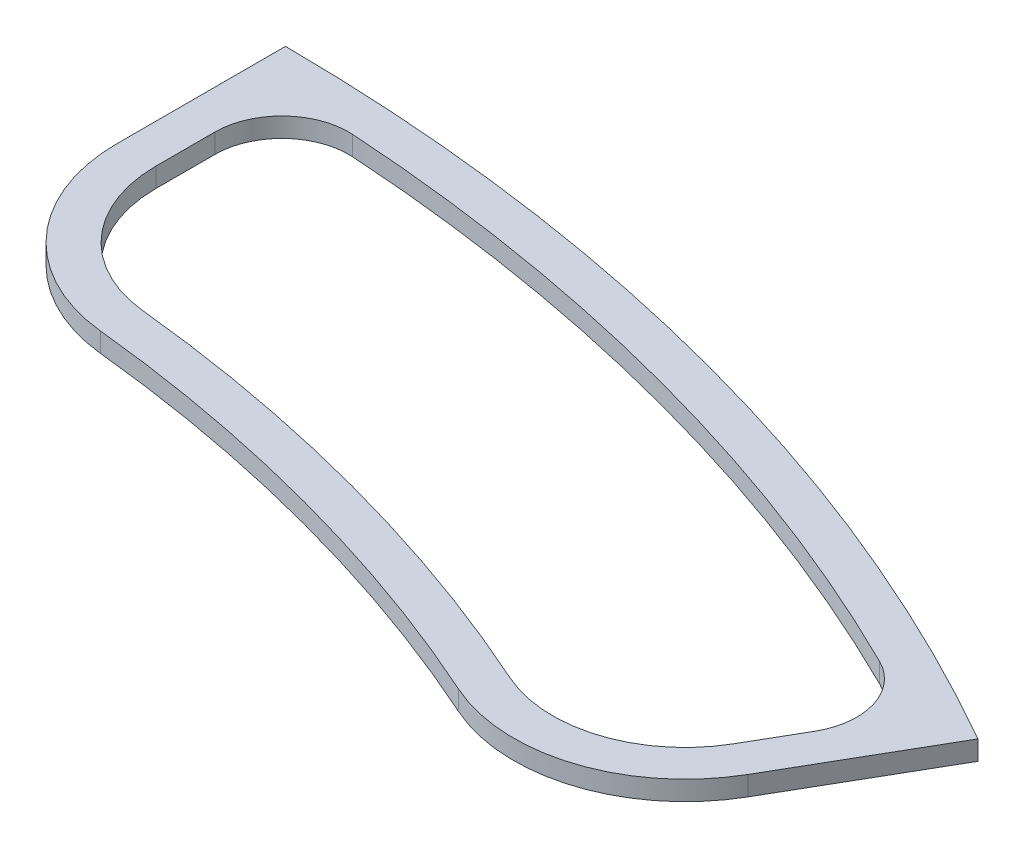
ISO-10303-21;
HEADER;
FILE_DESCRIPTION(('STEP AP214'),'2;1');
FILE_NAME('part.step','',(''),(''),'','','');
FILE_SCHEMA(('AUTOMOTIVE_DESIGN { 1 0 10303 214 1 1 1 1 }'));
ENDSEC;
DATA;
#1=APPLICATION_CONTEXT('core data for automotive mechanical design processes');
#2=APPLICATION_PROTOCOL_DEFINITION('international standard','automotive_design',2000,#1);
#3=PRODUCT_CONTEXT('',#1,'mechanical');
#4=PRODUCT('Part','Part','',(#3));
#5=PRODUCT_RELATED_PRODUCT_CATEGORY('part','',(#4));
#6=PRODUCT_DEFINITION_FORMATION('','',#4);
#7=PRODUCT_DEFINITION_CONTEXT('part definition',#1,'design');
#8=PRODUCT_DEFINITION('design','',#6,#7);
#9=PRODUCT_DEFINITION_SHAPE('','',#8);
#10=(LENGTH_UNIT() NAMED_UNIT(*) SI_UNIT(.MILLI.,.METRE.));
#11=(NAMED_UNIT(*) PLANE_ANGLE_UNIT() SI_UNIT($,.RADIAN.));
#12=(NAMED_UNIT(*) SI_UNIT($,.STERADIAN.) SOLID_ANGLE_UNIT());
#13=UNCERTAINTY_MEASURE_WITH_UNIT(LENGTH_MEASURE(1.E-05),#10,'distance_accuracy_value','');
#14=(GEOMETRIC_REPRESENTATION_CONTEXT(3) GLOBAL_UNCERTAINTY_ASSIGNED_CONTEXT((#13)) GLOBAL_UNIT_ASSIGNED_CONTEXT((#10,
#11,#12)) REPRESENTATION_CONTEXT('',''));
#15=CARTESIAN_POINT('',(0.,0.,0.));
#16=DIRECTION('',(0.,0.,1.));
#17=DIRECTION('',(1.,0.,0.));
#18=AXIS2_PLACEMENT_3D('',#15,#16,#17);
#19=CARTESIAN_POINT('',(0.,3.,0.));
#20=DIRECTION('',(0.,-1.,0.));
#21=DIRECTION('',(0.,0.,-1.));
#22=AXIS2_PLACEMENT_3D('',#19,#20,#21);
#23=CYLINDRICAL_SURFACE('',#22,297.5);
#24=CARTESIAN_POINT('',(0.,0.,0.));
#25=DIRECTION('',(0.,1.,0.));
#26=DIRECTION('',(0.,0.,-1.));
#27=AXIS2_PLACEMENT_3D('',#24,#25,#26);
#28=CIRCLE('',#27,297.5);
#29=CARTESIAN_POINT('',(147.449071126004,0.,-258.389282719076));
#30=VERTEX_POINT('',#29);
#31=CARTESIAN_POINT('',(1.50000000000001,0.,-297.496218463361));
#32=VERTEX_POINT('',#31);
#33=EDGE_CURVE('E160',#30,#32,#28,.T.);
#34=ORIENTED_EDGE('',*,*,#33,.T.);
#35=DIRECTION('',(0.,-1.,0.));
#36=VECTOR('',#35,1.);
#37=CARTESIAN_POINT('',(1.50000000000001,3.,-297.496218463361));
#38=LINE('',#37,#36);
#39=CARTESIAN_POINT('',(1.50000000000001,3.,-297.496218463361));
#40=VERTEX_POINT('',#39);
#41=EDGE_CURVE('E11',#40,#32,#38,.T.);
#42=ORIENTED_EDGE('',*,*,#41,.F.);
#43=CARTESIAN_POINT('',(0.,3.,0.));
#44=DIRECTION('',(0.,1.,0.));
#45=DIRECTION('',(0.,0.,-1.));
#46=AXIS2_PLACEMENT_3D('',#43,#44,#45);
#47=CIRCLE('',#46,297.5);
#48=CARTESIAN_POINT('',(147.449071126004,3.,-258.389282719076));
#49=VERTEX_POINT('',#48);
#50=EDGE_CURVE('E164',#49,#40,#47,.T.);
#51=ORIENTED_EDGE('',*,*,#50,.F.);
#52=DIRECTION('',(0.,-1.,0.));
#53=VECTOR('',#52,1.);
#54=CARTESIAN_POINT('',(147.449071126004,3.,-258.389282719076));
#55=LINE('',#54,#53);
#56=EDGE_CURVE('E170',#49,#30,#55,.T.);
#57=ORIENTED_EDGE('',*,*,#56,.T.);
#58=EDGE_LOOP('',(#34,#42,#51,#57));
#59=FACE_BOUND('',#58,.T.);
#60=ADVANCED_FACE('F47',(#59),#23,.T.);
#61=CARTESIAN_POINT('',(1.50000000000001,3.,-297.496218463361));
#62=DIRECTION('',(1.,0.,0.));
#63=DIRECTION('',(0.,0.,-1.));
#64=AXIS2_PLACEMENT_3D('',#61,#62,#63);
#65=PLANE('',#64);
#66=DIRECTION('',(0.,0.,1.));
#67=VECTOR('',#66,1.);
#68=CARTESIAN_POINT('',(1.50000000000001,0.,-297.496218463361));
#69=LINE('',#68,#67);
#70=CARTESIAN_POINT('',(1.50000000000001,0.,-271.496218463361));
#71=VERTEX_POINT('',#70);
#72=EDGE_CURVE('E76',#32,#71,#69,.T.);
#73=ORIENTED_EDGE('',*,*,#72,.T.);
#74=DIRECTION('',(0.,-1.,0.));
#75=VECTOR('',#74,1.);
#76=CARTESIAN_POINT('',(1.50000000000001,3.,-271.496218463361));
#77=LINE('',#76,#75);
#78=CARTESIAN_POINT('',(1.50000000000001,3.,-271.496218463361));
#79=VERTEX_POINT('',#78);
#80=EDGE_CURVE('E56',#79,#71,#77,.T.);
#81=ORIENTED_EDGE('',*,*,#80,.F.);
#82=DIRECTION('',(0.,0.,1.));
#83=VECTOR('',#82,1.);
#84=CARTESIAN_POINT('',(1.50000000000001,3.,-297.496218463361));
#85=LINE('',#84,#83);
#86=EDGE_CURVE('E180',#40,#79,#85,.T.);
#87=ORIENTED_EDGE('',*,*,#86,.F.);
#88=ORIENTED_EDGE('',*,*,#41,.T.);
#89=EDGE_LOOP('',(#73,#81,#87,#88));
#90=FACE_BOUND('',#89,.T.);
#91=ADVANCED_FACE('F155',(#90),#65,.F.);
#92=CARTESIAN_POINT('',(147.449071126004,3.,-258.389282719076));
#93=DIRECTION('',(-0.866025403784438,0.,-0.500000000000001));
#94=DIRECTION('',(-0.500000000000001,0.,0.866025403784438));
#95=AXIS2_PLACEMENT_3D('',#92,#93,#94);
#96=PLANE('',#95);
#97=DIRECTION('',(0.500000000000001,0.,-0.866025403784438));
#98=VECTOR('',#97,1.);
#99=CARTESIAN_POINT('',(147.449071126004,0.,-258.389282719076));
#100=LINE('',#99,#98);
#101=CARTESIAN_POINT('',(134.449071126004,0.,-235.87262222068));
#102=VERTEX_POINT('',#101);
#103=EDGE_CURVE('E159',#102,#30,#100,.T.);
#104=ORIENTED_EDGE('',*,*,#103,.T.);
#105=ORIENTED_EDGE('',*,*,#56,.F.);
#106=DIRECTION('',(0.500000000000001,0.,-0.866025403784438));
#107=VECTOR('',#106,1.);
#108=CARTESIAN_POINT('',(147.449071126004,3.,-258.389282719076));
#109=LINE('',#108,#107);
#110=CARTESIAN_POINT('',(134.449071126004,3.,-235.87262222068));
#111=VERTEX_POINT('',#110);
#112=EDGE_CURVE('E64',#111,#49,#109,.T.);
#113=ORIENTED_EDGE('',*,*,#112,.F.);
#114=DIRECTION('',(0.,-1.,0.));
#115=VECTOR('',#114,1.);
#116=CARTESIAN_POINT('',(134.449071126004,3.,-235.87262222068));
#117=LINE('',#116,#115);
#118=EDGE_CURVE('E148',#111,#102,#117,.T.);
#119=ORIENTED_EDGE('',*,*,#118,.T.);
#120=EDGE_LOOP('',(#104,#105,#113,#119));
#121=FACE_BOUND('',#120,.T.);
#122=ADVANCED_FACE('F176',(#121),#96,.F.);
#123=CARTESIAN_POINT('',(0.,3.,0.));
#124=DIRECTION('',(0.,-1.,0.));
#125=DIRECTION('',(0.,0.,-1.));
#126=AXIS2_PLACEMENT_3D('',#123,#124,#125);
#127=PLANE('',#126);
#128=CARTESIAN_POINT('',(111.561258711809,3.,-249.086906879178));
#129=DIRECTION('',(0.,1.,0.));
#130=DIRECTION('',(0.,0.,-1.));
#131=AXIS2_PLACEMENT_3D('',#128,#129,#130);
#132=CIRCLE('',#131,26.4285693169951);
#133=CARTESIAN_POINT('',(100.758430139325,3.,-224.967036005213));
#134=VERTEX_POINT('',#133);
#135=EDGE_CURVE('E236',#134,#111,#132,.T.);
#136=ORIENTED_EDGE('',*,*,#135,.T.);
#137=ORIENTED_EDGE('',*,*,#112,.T.);
#138=ORIENTED_EDGE('',*,*,#50,.T.);
#139=ORIENTED_EDGE('',*,*,#86,.T.);
#140=CARTESIAN_POINT('',(27.9285693169951,3.,-271.496218463361));
#141=DIRECTION('',(0.,1.,0.));
#142=DIRECTION('',(0.,0.,-1.));
#143=AXIS2_PLACEMENT_3D('',#140,#141,#142);
#144=CIRCLE('',#143,26.4285693169951);
#145=CARTESIAN_POINT('',(25.2241578565113,3.,-245.206383264265));
#146=VERTEX_POINT('',#145);
#147=EDGE_CURVE('E144',#79,#146,#144,.T.);
#148=ORIENTED_EDGE('',*,*,#147,.T.);
#149=CARTESIAN_POINT('',(0.,3.,0.));
#150=DIRECTION('',(0.,-1.,0.));
#151=DIRECTION('',(0.,0.,1.));
#152=AXIS2_PLACEMENT_3D('',#149,#150,#151);
#153=CIRCLE('',#152,246.500362135864);
#154=EDGE_CURVE('E218',#146,#134,#153,.T.);
#155=ORIENTED_EDGE('',*,*,#154,.T.);
#156=EDGE_LOOP('',(#136,#137,#138,#139,#148,#155));
#157=FACE_BOUND('',#156,.T.);
#158=CARTESIAN_POINT('',(124.906291721947,3.,-251.939280809483));
#159=DIRECTION('',(0.,1.,0.));
#160=DIRECTION('',(0.,0.,-1.));
#161=AXIS2_PLACEMENT_3D('',#158,#159,#160);
#162=CIRCLE('',#161,10.2976186810259);
#163=CARTESIAN_POINT('',(133.8242910982,3.,-246.79047146897));
#164=VERTEX_POINT('',#163);
#165=CARTESIAN_POINT('',(129.480348671786,3.,-261.165274171687));
#166=VERTEX_POINT('',#165);
#167=EDGE_CURVE('E276',#164,#166,#162,.T.);
#168=ORIENTED_EDGE('',*,*,#167,.F.);
#169=DIRECTION('',(0.5,0.,-0.866025403784438));
#170=VECTOR('',#169,1.);
#171=CARTESIAN_POINT('',(129.203185143459,3.,-238.786481168198));
#172=LINE('',#171,#170);
#173=CARTESIAN_POINT('',(129.252918703298,3.,-238.87262222068));
#174=VERTEX_POINT('',#173);
#175=EDGE_CURVE('E185',#174,#164,#172,.T.);
#176=ORIENTED_EDGE('',*,*,#175,.F.);
#177=CARTESIAN_POINT('',(111.561258711809,3.,-249.086906879178));
#178=DIRECTION('',(0.,-1.,0.));
#179=DIRECTION('',(0.,0.,-1.));
#180=AXIS2_PLACEMENT_3D('',#177,#178,#179);
#181=CIRCLE('',#180,20.4285693169951);
#182=CARTESIAN_POINT('',(103.21096438957,3.,-230.442899019513));
#183=VERTEX_POINT('',#182);
#184=EDGE_CURVE('E232',#174,#183,#181,.T.);
#185=ORIENTED_EDGE('',*,*,#184,.T.);
#186=CARTESIAN_POINT('',(0.,3.,0.));
#187=DIRECTION('',(0.,1.,0.));
#188=DIRECTION('',(0.,0.,1.));
#189=AXIS2_PLACEMENT_3D('',#186,#187,#188);
#190=CIRCLE('',#189,252.500362135864);
#191=CARTESIAN_POINT('',(25.8381323992978,3.,-251.174886867415));
#192=VERTEX_POINT('',#191);
#193=EDGE_CURVE('E228',#183,#192,#190,.T.);
#194=ORIENTED_EDGE('',*,*,#193,.T.);
#195=CARTESIAN_POINT('',(27.9285693169951,3.,-271.496218463361));
#196=DIRECTION('',(0.,-1.,0.));
#197=DIRECTION('',(0.,0.,-1.));
#198=AXIS2_PLACEMENT_3D('',#195,#196,#197);
#199=CIRCLE('',#198,20.4285693169951);
#200=CARTESIAN_POINT('',(7.50000000000002,3.,-271.496218463361));
#201=VERTEX_POINT('',#200);
#202=EDGE_CURVE('E224',#192,#201,#199,.T.);
#203=ORIENTED_EDGE('',*,*,#202,.T.);
#204=DIRECTION('',(0.,0.,1.));
#205=VECTOR('',#204,1.);
#206=CARTESIAN_POINT('',(7.50000000000001,3.,-286.402177896714));
#207=LINE('',#206,#205);
#208=CARTESIAN_POINT('',(7.50000000000001,3.,-280.638963253167));
#209=VERTEX_POINT('',#208);
#210=EDGE_CURVE('E191',#209,#201,#207,.T.);
#211=ORIENTED_EDGE('',*,*,#210,.F.);
#212=CARTESIAN_POINT('',(17.7976186810258,3.,-280.638963253167));
#213=DIRECTION('',(0.,1.,0.));
#214=DIRECTION('',(0.,0.,1.));
#215=AXIS2_PLACEMENT_3D('',#212,#213,#214);
#216=CIRCLE('',#215,10.2976186810259);
#217=CARTESIAN_POINT('',(18.4493658452101,3.,-290.915936354902));
#218=VERTEX_POINT('',#217);
#219=EDGE_CURVE('E280',#218,#209,#216,.T.);
#220=ORIENTED_EDGE('',*,*,#219,.F.);
#221=CARTESIAN_POINT('',(0.,3.,0.));
#222=DIRECTION('',(0.,1.,0.));
#223=DIRECTION('',(0.,0.,1.));
#224=AXIS2_PLACEMENT_3D('',#221,#222,#223);
#225=CIRCLE('',#224,291.500362135864);
#226=EDGE_CURVE('E271',#166,#218,#225,.T.);
#227=ORIENTED_EDGE('',*,*,#226,.F.);
#228=EDGE_LOOP('',(#168,#176,#185,#194,#203,#211,#220,#227));
#229=FACE_BOUND('',#228,.T.);
#230=ADVANCED_FACE('F327',(#157,#229),#127,.F.);
#231=CARTESIAN_POINT('',(0.,0.,0.));
#232=DIRECTION('',(0.,-1.,0.));
#233=DIRECTION('',(0.,0.,-1.));
#234=AXIS2_PLACEMENT_3D('',#231,#232,#233);
#235=PLANE('',#234);
#236=DIRECTION('',(0.5,0.,-0.866025403784438));
#237=VECTOR('',#236,1.);
#238=CARTESIAN_POINT('',(129.203185143459,0.,-238.786481168198));
#239=LINE('',#238,#237);
#240=CARTESIAN_POINT('',(129.252918703298,0.,-238.87262222068));
#241=VERTEX_POINT('',#240);
#242=CARTESIAN_POINT('',(133.8242910982,0.,-246.79047146897));
#243=VERTEX_POINT('',#242);
#244=EDGE_CURVE('E166',#241,#243,#239,.T.);
#245=ORIENTED_EDGE('',*,*,#244,.T.);
#246=CARTESIAN_POINT('',(124.906291721947,0.,-251.939280809483));
#247=DIRECTION('',(0.,1.,0.));
#248=DIRECTION('',(0.,0.,-1.));
#249=AXIS2_PLACEMENT_3D('',#246,#247,#248);
#250=CIRCLE('',#249,10.2976186810259);
#251=CARTESIAN_POINT('',(129.480348671786,0.,-261.165274171687));
#252=VERTEX_POINT('',#251);
#253=EDGE_CURVE('E287',#243,#252,#250,.T.);
#254=ORIENTED_EDGE('',*,*,#253,.T.);
#255=CARTESIAN_POINT('',(0.,0.,0.));
#256=DIRECTION('',(0.,1.,0.));
#257=DIRECTION('',(0.,0.,1.));
#258=AXIS2_PLACEMENT_3D('',#255,#256,#257);
#259=CIRCLE('',#258,291.500362135864);
#260=CARTESIAN_POINT('',(18.4493658452101,0.,-290.915936354902));
#261=VERTEX_POINT('',#260);
#262=EDGE_CURVE('E260',#252,#261,#259,.T.);
#263=ORIENTED_EDGE('',*,*,#262,.T.);
#264=CARTESIAN_POINT('',(17.7976186810258,0.,-280.638963253167));
#265=DIRECTION('',(0.,1.,0.));
#266=DIRECTION('',(0.,0.,1.));
#267=AXIS2_PLACEMENT_3D('',#264,#265,#266);
#268=CIRCLE('',#267,10.2976186810259);
#269=CARTESIAN_POINT('',(7.50000000000001,0.,-280.638963253167));
#270=VERTEX_POINT('',#269);
#271=EDGE_CURVE('E275',#261,#270,#268,.T.);
#272=ORIENTED_EDGE('',*,*,#271,.T.);
#273=DIRECTION('',(0.,0.,1.));
#274=VECTOR('',#273,1.);
#275=CARTESIAN_POINT('',(7.50000000000001,0.,-286.402177896714));
#276=LINE('',#275,#274);
#277=CARTESIAN_POINT('',(7.50000000000002,0.,-271.496218463361));
#278=VERTEX_POINT('',#277);
#279=EDGE_CURVE('E190',#270,#278,#276,.T.);
#280=ORIENTED_EDGE('',*,*,#279,.T.);
#281=CARTESIAN_POINT('',(27.9285693169951,0.,-271.496218463361));
#282=DIRECTION('',(0.,-1.,0.));
#283=DIRECTION('',(0.,0.,-1.));
#284=AXIS2_PLACEMENT_3D('',#281,#282,#283);
#285=CIRCLE('',#284,20.4285693169951);
#286=CARTESIAN_POINT('',(25.8381323992978,0.,-251.174886867415));
#287=VERTEX_POINT('',#286);
#288=EDGE_CURVE('E153',#287,#278,#285,.T.);
#289=ORIENTED_EDGE('',*,*,#288,.F.);
#290=CARTESIAN_POINT('',(0.,0.,0.));
#291=DIRECTION('',(0.,1.,0.));
#292=DIRECTION('',(0.,0.,1.));
#293=AXIS2_PLACEMENT_3D('',#290,#291,#292);
#294=CIRCLE('',#293,252.500362135864);
#295=CARTESIAN_POINT('',(103.21096438957,0.,-230.442899019513));
#296=VERTEX_POINT('',#295);
#297=EDGE_CURVE('E245',#296,#287,#294,.T.);
#298=ORIENTED_EDGE('',*,*,#297,.F.);
#299=CARTESIAN_POINT('',(111.561258711809,0.,-249.086906879178));
#300=DIRECTION('',(0.,-1.,0.));
#301=DIRECTION('',(0.,0.,-1.));
#302=AXIS2_PLACEMENT_3D('',#299,#300,#301);
#303=CIRCLE('',#302,20.4285693169951);
#304=EDGE_CURVE('E249',#241,#296,#303,.T.);
#305=ORIENTED_EDGE('',*,*,#304,.F.);
#306=EDGE_LOOP('',(#245,#254,#263,#272,#280,#289,#298,#305));
#307=FACE_BOUND('',#306,.T.);
#308=ORIENTED_EDGE('',*,*,#103,.F.);
#309=CARTESIAN_POINT('',(111.561258711809,0.,-249.086906879178));
#310=DIRECTION('',(0.,1.,0.));
#311=DIRECTION('',(0.,0.,-1.));
#312=AXIS2_PLACEMENT_3D('',#309,#310,#311);
#313=CIRCLE('',#312,26.4285693169951);
#314=CARTESIAN_POINT('',(100.758430139325,0.,-224.967036005213));
#315=VERTEX_POINT('',#314);
#316=EDGE_CURVE('E120',#315,#102,#313,.T.);
#317=ORIENTED_EDGE('',*,*,#316,.F.);
#318=CARTESIAN_POINT('',(0.,0.,0.));
#319=DIRECTION('',(0.,-1.,0.));
#320=DIRECTION('',(0.,0.,1.));
#321=AXIS2_PLACEMENT_3D('',#318,#319,#320);
#322=CIRCLE('',#321,246.500362135864);
#323=CARTESIAN_POINT('',(25.2241578565113,0.,-245.206383264265));
#324=VERTEX_POINT('',#323);
#325=EDGE_CURVE('E151',#324,#315,#322,.T.);
#326=ORIENTED_EDGE('',*,*,#325,.F.);
#327=CARTESIAN_POINT('',(27.9285693169951,0.,-271.496218463361));
#328=DIRECTION('',(0.,1.,0.));
#329=DIRECTION('',(0.,0.,-1.));
#330=AXIS2_PLACEMENT_3D('',#327,#328,#329);
#331=CIRCLE('',#330,26.4285693169951);
#332=EDGE_CURVE('E141',#71,#324,#331,.T.);
#333=ORIENTED_EDGE('',*,*,#332,.F.);
#334=ORIENTED_EDGE('',*,*,#72,.F.);
#335=ORIENTED_EDGE('',*,*,#33,.F.);
#336=EDGE_LOOP('',(#308,#317,#326,#333,#334,#335));
#337=FACE_BOUND('',#336,.T.);
#338=ADVANCED_FACE('F150',(#307,#337),#235,.T.);
#339=CARTESIAN_POINT('',(7.50000000000001,0.,-286.402177896714));
#340=DIRECTION('',(-1.,0.,0.));
#341=DIRECTION('',(0.,0.,1.));
#342=AXIS2_PLACEMENT_3D('',#339,#340,#341);
#343=PLANE('',#342);
#344=ORIENTED_EDGE('',*,*,#210,.T.);
#345=DIRECTION('',(0.,1.,0.));
#346=VECTOR('',#345,1.);
#347=CARTESIAN_POINT('',(7.50000000000002,0.,-271.496218463361));
#348=LINE('',#347,#346);
#349=EDGE_CURVE('E209',#278,#201,#348,.T.);
#350=ORIENTED_EDGE('',*,*,#349,.F.);
#351=ORIENTED_EDGE('',*,*,#279,.F.);
#352=DIRECTION('',(0.,1.,0.));
#353=VECTOR('',#352,1.);
#354=CARTESIAN_POINT('',(7.50000000000001,0.,-280.638963253167));
#355=LINE('',#354,#353);
#356=EDGE_CURVE('E255',#270,#209,#355,.T.);
#357=ORIENTED_EDGE('',*,*,#356,.T.);
#358=EDGE_LOOP('',(#344,#350,#351,#357));
#359=FACE_BOUND('',#358,.T.);
#360=ADVANCED_FACE('F330',(#359),#343,.F.);
#361=CARTESIAN_POINT('',(129.203185143459,0.,-238.786481168198));
#362=DIRECTION('',(0.866025403784438,0.,0.5));
#363=DIRECTION('',(0.5,0.,-0.866025403784438));
#364=AXIS2_PLACEMENT_3D('',#361,#362,#363);
#365=PLANE('',#364);
#366=ORIENTED_EDGE('',*,*,#244,.F.);
#367=DIRECTION('',(0.,1.,0.));
#368=VECTOR('',#367,1.);
#369=CARTESIAN_POINT('',(129.252918703298,0.,-238.87262222068));
#370=LINE('',#369,#368);
#371=EDGE_CURVE('E199',#241,#174,#370,.T.);
#372=ORIENTED_EDGE('',*,*,#371,.T.);
#373=ORIENTED_EDGE('',*,*,#175,.T.);
#374=DIRECTION('',(0.,1.,0.));
#375=VECTOR('',#374,1.);
#376=CARTESIAN_POINT('',(133.8242910982,0.,-246.79047146897));
#377=LINE('',#376,#375);
#378=EDGE_CURVE('E259',#243,#164,#377,.T.);
#379=ORIENTED_EDGE('',*,*,#378,.F.);
#380=EDGE_LOOP('',(#366,#372,#373,#379));
#381=FACE_BOUND('',#380,.T.);
#382=ADVANCED_FACE('F343',(#381),#365,.F.);
#383=CARTESIAN_POINT('',(111.561258711809,0.,-249.086906879178));
#384=DIRECTION('',(0.,1.,0.));
#385=DIRECTION('',(0.,0.,1.));
#386=AXIS2_PLACEMENT_3D('',#383,#384,#385);
#387=CYLINDRICAL_SURFACE('',#386,26.4285693169951);
#388=ORIENTED_EDGE('',*,*,#135,.F.);
#389=DIRECTION('',(0.,1.,0.));
#390=VECTOR('',#389,1.);
#391=CARTESIAN_POINT('',(100.758430139325,0.,-224.967036005213));
#392=LINE('',#391,#390);
#393=EDGE_CURVE('E85',#315,#134,#392,.T.);
#394=ORIENTED_EDGE('',*,*,#393,.F.);
#395=ORIENTED_EDGE('',*,*,#316,.T.);
#396=ORIENTED_EDGE('',*,*,#118,.F.);
#397=EDGE_LOOP('',(#388,#394,#395,#396));
#398=FACE_BOUND('',#397,.T.);
#399=ADVANCED_FACE('F345',(#398),#387,.T.);
#400=CARTESIAN_POINT('',(0.,0.,0.));
#401=DIRECTION('',(0.,1.,0.));
#402=DIRECTION('',(0.,0.,1.));
#403=AXIS2_PLACEMENT_3D('',#400,#401,#402);
#404=CYLINDRICAL_SURFACE('',#403,246.500362135864);
#405=ORIENTED_EDGE('',*,*,#154,.F.);
#406=DIRECTION('',(0.,1.,0.));
#407=VECTOR('',#406,1.);
#408=CARTESIAN_POINT('',(25.2241578565113,0.,-245.206383264265));
#409=LINE('',#408,#407);
#410=EDGE_CURVE('E213',#324,#146,#409,.T.);
#411=ORIENTED_EDGE('',*,*,#410,.F.);
#412=ORIENTED_EDGE('',*,*,#325,.T.);
#413=ORIENTED_EDGE('',*,*,#393,.T.);
#414=EDGE_LOOP('',(#405,#411,#412,#413));
#415=FACE_BOUND('',#414,.T.);
#416=ADVANCED_FACE('F351',(#415),#404,.F.);
#417=CARTESIAN_POINT('',(27.9285693169951,0.,-271.496218463361));
#418=DIRECTION('',(0.,1.,0.));
#419=DIRECTION('',(0.,0.,1.));
#420=AXIS2_PLACEMENT_3D('',#417,#418,#419);
#421=CYLINDRICAL_SURFACE('',#420,26.4285693169951);
#422=ORIENTED_EDGE('',*,*,#147,.F.);
#423=ORIENTED_EDGE('',*,*,#80,.T.);
#424=ORIENTED_EDGE('',*,*,#332,.T.);
#425=ORIENTED_EDGE('',*,*,#410,.T.);
#426=EDGE_LOOP('',(#422,#423,#424,#425));
#427=FACE_BOUND('',#426,.T.);
#428=ADVANCED_FACE('F140',(#427),#421,.T.);
#429=CARTESIAN_POINT('',(27.9285693169951,0.,-271.496218463361));
#430=DIRECTION('',(0.,1.,0.));
#431=DIRECTION('',(0.,0.,1.));
#432=AXIS2_PLACEMENT_3D('',#429,#430,#431);
#433=CYLINDRICAL_SURFACE('',#432,20.4285693169951);
#434=ORIENTED_EDGE('',*,*,#202,.F.);
#435=DIRECTION('',(0.,1.,0.));
#436=VECTOR('',#435,1.);
#437=CARTESIAN_POINT('',(25.8381323992978,0.,-251.174886867415));
#438=LINE('',#437,#436);
#439=EDGE_CURVE('E206',#287,#192,#438,.T.);
#440=ORIENTED_EDGE('',*,*,#439,.F.);
#441=ORIENTED_EDGE('',*,*,#288,.T.);
#442=ORIENTED_EDGE('',*,*,#349,.T.);
#443=EDGE_LOOP('',(#434,#440,#441,#442));
#444=FACE_BOUND('',#443,.T.);
#445=ADVANCED_FACE('F332',(#444),#433,.F.);
#446=CARTESIAN_POINT('',(0.,0.,0.));
#447=DIRECTION('',(0.,1.,0.));
#448=DIRECTION('',(0.,0.,1.));
#449=AXIS2_PLACEMENT_3D('',#446,#447,#448);
#450=CYLINDRICAL_SURFACE('',#449,252.500362135864);
#451=ORIENTED_EDGE('',*,*,#193,.F.);
#452=DIRECTION('',(0.,1.,0.));
#453=VECTOR('',#452,1.);
#454=CARTESIAN_POINT('',(103.21096438957,0.,-230.442899019513));
#455=LINE('',#454,#453);
#456=EDGE_CURVE('E203',#296,#183,#455,.T.);
#457=ORIENTED_EDGE('',*,*,#456,.F.);
#458=ORIENTED_EDGE('',*,*,#297,.T.);
#459=ORIENTED_EDGE('',*,*,#439,.T.);
#460=EDGE_LOOP('',(#451,#457,#458,#459));
#461=FACE_BOUND('',#460,.T.);
#462=ADVANCED_FACE('F337',(#461),#450,.T.);
#463=CARTESIAN_POINT('',(111.561258711809,0.,-249.086906879178));
#464=DIRECTION('',(0.,1.,0.));
#465=DIRECTION('',(0.,0.,1.));
#466=AXIS2_PLACEMENT_3D('',#463,#464,#465);
#467=CYLINDRICAL_SURFACE('',#466,20.4285693169951);
#468=ORIENTED_EDGE('',*,*,#184,.F.);
#469=ORIENTED_EDGE('',*,*,#371,.F.);
#470=ORIENTED_EDGE('',*,*,#304,.T.);
#471=ORIENTED_EDGE('',*,*,#456,.T.);
#472=EDGE_LOOP('',(#468,#469,#470,#471));
#473=FACE_BOUND('',#472,.T.);
#474=ADVANCED_FACE('F340',(#473),#467,.F.);
#475=CARTESIAN_POINT('',(17.7976186810258,0.,-280.638963253167));
#476=DIRECTION('',(0.,1.,0.));
#477=DIRECTION('',(0.,0.,1.));
#478=AXIS2_PLACEMENT_3D('',#475,#476,#477);
#479=CYLINDRICAL_SURFACE('',#478,10.2976186810259);
#480=ORIENTED_EDGE('',*,*,#219,.T.);
#481=ORIENTED_EDGE('',*,*,#356,.F.);
#482=ORIENTED_EDGE('',*,*,#271,.F.);
#483=DIRECTION('',(0.,1.,0.));
#484=VECTOR('',#483,1.);
#485=CARTESIAN_POINT('',(18.4493658452101,0.,-290.915936354902));
#486=LINE('',#485,#484);
#487=EDGE_CURVE('E239',#261,#218,#486,.T.);
#488=ORIENTED_EDGE('',*,*,#487,.T.);
#489=EDGE_LOOP('',(#480,#481,#482,#488));
#490=FACE_BOUND('',#489,.T.);
#491=ADVANCED_FACE('F304',(#490),#479,.F.);
#492=CARTESIAN_POINT('',(0.,0.,0.));
#493=DIRECTION('',(0.,1.,0.));
#494=DIRECTION('',(0.,0.,1.));
#495=AXIS2_PLACEMENT_3D('',#492,#493,#494);
#496=CYLINDRICAL_SURFACE('',#495,291.500362135864);
#497=ORIENTED_EDGE('',*,*,#226,.T.);
#498=ORIENTED_EDGE('',*,*,#487,.F.);
#499=ORIENTED_EDGE('',*,*,#262,.F.);
#500=DIRECTION('',(0.,1.,0.));
#501=VECTOR('',#500,1.);
#502=CARTESIAN_POINT('',(129.480348671786,0.,-261.165274171687));
#503=LINE('',#502,#501);
#504=EDGE_CURVE('E264',#252,#166,#503,.T.);
#505=ORIENTED_EDGE('',*,*,#504,.T.);
#506=EDGE_LOOP('',(#497,#498,#499,#505));
#507=FACE_BOUND('',#506,.T.);
#508=ADVANCED_FACE('F318',(#507),#496,.F.);
#509=CARTESIAN_POINT('',(124.906291721947,0.,-251.939280809483));
#510=DIRECTION('',(0.,1.,0.));
#511=DIRECTION('',(0.,0.,1.));
#512=AXIS2_PLACEMENT_3D('',#509,#510,#511);
#513=CYLINDRICAL_SURFACE('',#512,10.2976186810259);
#514=ORIENTED_EDGE('',*,*,#167,.T.);
#515=ORIENTED_EDGE('',*,*,#504,.F.);
#516=ORIENTED_EDGE('',*,*,#253,.F.);
#517=ORIENTED_EDGE('',*,*,#378,.T.);
#518=EDGE_LOOP('',(#514,#515,#516,#517));
#519=FACE_BOUND('',#518,.T.);
#520=ADVANCED_FACE('F324',(#519),#513,.F.);
#521=CLOSED_SHELL('',(#60,#91,#122,#230,#338,#360,#382,#399,#416,#428,#445,#462,#474,#491,#508,#520));
#522=MANIFOLD_SOLID_BREP('B2',#521);
#523=ADVANCED_BREP_SHAPE_REPRESENTATION('',(#18,#522),#14);
#524=SHAPE_DEFINITION_REPRESENTATION(#9,#523);
ENDSEC;
END-ISO-10303-21;
